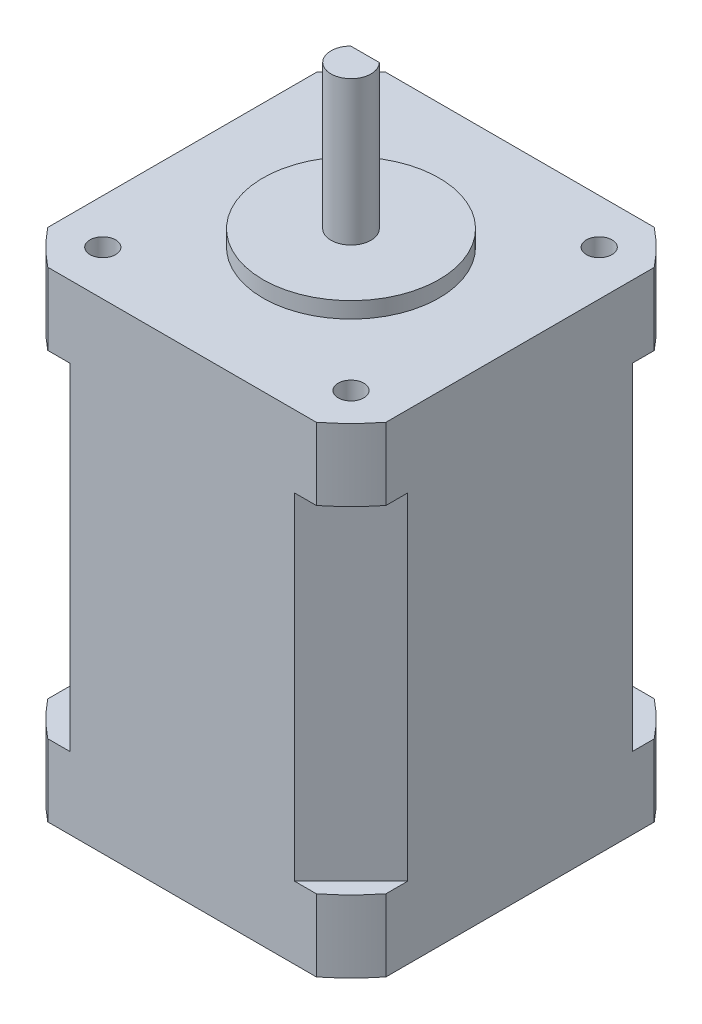
ISO-10303-21;
HEADER;
FILE_DESCRIPTION(('STEP AP214'),'2;1');
FILE_NAME('part.step','',(''),(''),'','','');
FILE_SCHEMA(('AUTOMOTIVE_DESIGN { 1 0 10303 214 1 1 1 1 }'));
ENDSEC;
DATA;
#1=APPLICATION_CONTEXT('core data for automotive mechanical design processes');
#2=APPLICATION_PROTOCOL_DEFINITION('international standard','automotive_design',2000,#1);
#3=PRODUCT_CONTEXT('',#1,'mechanical');
#4=PRODUCT('Part','Part','',(#3));
#5=PRODUCT_RELATED_PRODUCT_CATEGORY('part','',(#4));
#6=PRODUCT_DEFINITION_FORMATION('','',#4);
#7=PRODUCT_DEFINITION_CONTEXT('part definition',#1,'design');
#8=PRODUCT_DEFINITION('design','',#6,#7);
#9=PRODUCT_DEFINITION_SHAPE('','',#8);
#10=(LENGTH_UNIT() NAMED_UNIT(*) SI_UNIT(.MILLI.,.METRE.));
#11=(NAMED_UNIT(*) PLANE_ANGLE_UNIT() SI_UNIT($,.RADIAN.));
#12=(NAMED_UNIT(*) SI_UNIT($,.STERADIAN.) SOLID_ANGLE_UNIT());
#13=UNCERTAINTY_MEASURE_WITH_UNIT(LENGTH_MEASURE(1.E-05),#10,'distance_accuracy_value','');
#14=(GEOMETRIC_REPRESENTATION_CONTEXT(3) GLOBAL_UNCERTAINTY_ASSIGNED_CONTEXT((#13)) GLOBAL_UNIT_ASSIGNED_CONTEXT((#10,
#11,#12)) REPRESENTATION_CONTEXT('',''));
#15=CARTESIAN_POINT('',(0.,0.,0.));
#16=DIRECTION('',(0.,0.,1.));
#17=DIRECTION('',(1.,0.,0.));
#18=AXIS2_PLACEMENT_3D('',#15,#16,#17);
#19=CARTESIAN_POINT('',(-14.0127343282139,60.,-22.4477631707579));
#20=DIRECTION('',(0.707106781186551,0.,0.707106781186544));
#21=DIRECTION('',(0.707106781186544,0.,-0.707106781186551));
#22=AXIS2_PLACEMENT_3D('',#19,#20,#21);
#23=PLANE('',#22);
#24=DIRECTION('',(0.707106781186544,0.,-0.707106781186551));
#25=VECTOR('',#24,1.);
#26=CARTESIAN_POINT('',(-14.0127343282139,9.,-22.4477631707579));
#27=LINE('',#26,#25);
#28=CARTESIAN_POINT('',(-21.0838021400793,9.,-15.3766953588924));
#29=VERTEX_POINT('',#28);
#30=CARTESIAN_POINT('',(-14.0127343282139,9.,-22.4477631707579));
#31=VERTEX_POINT('',#30);
#32=EDGE_CURVE('E346',#29,#31,#27,.T.);
#33=ORIENTED_EDGE('',*,*,#32,.F.);
#34=DIRECTION('',(0.,-1.,0.));
#35=VECTOR('',#34,1.);
#36=CARTESIAN_POINT('',(-21.0838021400793,60.,-15.3766953588924));
#37=LINE('',#36,#35);
#38=CARTESIAN_POINT('',(-21.0838021400793,51.,-15.3766953588924));
#39=VERTEX_POINT('',#38);
#40=EDGE_CURVE('E485',#39,#29,#37,.T.);
#41=ORIENTED_EDGE('',*,*,#40,.F.);
#42=DIRECTION('',(-0.707106781186544,0.,0.707106781186551));
#43=VECTOR('',#42,1.);
#44=CARTESIAN_POINT('',(-14.0127343282139,51.,-22.4477631707579));
#45=LINE('',#44,#43);
#46=CARTESIAN_POINT('',(-14.0127343282139,51.,-22.4477631707579));
#47=VERTEX_POINT('',#46);
#48=EDGE_CURVE('E437',#47,#39,#45,.T.);
#49=ORIENTED_EDGE('',*,*,#48,.F.);
#50=DIRECTION('',(0.,-1.,0.));
#51=VECTOR('',#50,1.);
#52=CARTESIAN_POINT('',(-14.0127343282139,60.,-22.4477631707579));
#53=LINE('',#52,#51);
#54=EDGE_CURVE('E68',#47,#31,#53,.T.);
#55=ORIENTED_EDGE('',*,*,#54,.T.);
#56=EDGE_LOOP('',(#33,#41,#49,#55));
#57=FACE_BOUND('',#56,.T.);
#58=ADVANCED_FACE('F42',(#57),#23,.F.);
#59=CARTESIAN_POINT('',(-21.0838021400793,60.,12.6811690173767));
#60=DIRECTION('',(0.707106781186543,0.,-0.707106781186552));
#61=DIRECTION('',(-0.707106781186552,0.,-0.707106781186543));
#62=AXIS2_PLACEMENT_3D('',#59,#60,#61);
#63=PLANE('',#62);
#64=DIRECTION('',(-0.707106781186552,0.,-0.707106781186543));
#65=VECTOR('',#64,1.);
#66=CARTESIAN_POINT('',(-21.0838021400793,9.,12.6811690173767));
#67=LINE('',#66,#65);
#68=CARTESIAN_POINT('',(-14.0127343282138,9.,19.7522368292421));
#69=VERTEX_POINT('',#68);
#70=CARTESIAN_POINT('',(-21.0838021400793,9.,12.6811690173767));
#71=VERTEX_POINT('',#70);
#72=EDGE_CURVE('E342',#69,#71,#67,.T.);
#73=ORIENTED_EDGE('',*,*,#72,.F.);
#74=DIRECTION('',(0.,-1.,0.));
#75=VECTOR('',#74,1.);
#76=CARTESIAN_POINT('',(-14.0127343282138,60.,19.7522368292421));
#77=LINE('',#76,#75);
#78=CARTESIAN_POINT('',(-14.0127343282138,51.,19.7522368292421));
#79=VERTEX_POINT('',#78);
#80=EDGE_CURVE('E478',#79,#69,#77,.T.);
#81=ORIENTED_EDGE('',*,*,#80,.F.);
#82=DIRECTION('',(0.707106781186552,0.,0.707106781186543));
#83=VECTOR('',#82,1.);
#84=CARTESIAN_POINT('',(-21.0838021400793,51.,12.6811690173767));
#85=LINE('',#84,#83);
#86=CARTESIAN_POINT('',(-21.0838021400793,51.,12.6811690173767));
#87=VERTEX_POINT('',#86);
#88=EDGE_CURVE('E434',#87,#79,#85,.T.);
#89=ORIENTED_EDGE('',*,*,#88,.F.);
#90=DIRECTION('',(0.,-1.,0.));
#91=VECTOR('',#90,1.);
#92=CARTESIAN_POINT('',(-21.0838021400793,60.,12.6811690173767));
#93=LINE('',#92,#91);
#94=EDGE_CURVE('E482',#87,#71,#93,.T.);
#95=ORIENTED_EDGE('',*,*,#94,.T.);
#96=EDGE_LOOP('',(#73,#81,#89,#95));
#97=FACE_BOUND('',#96,.T.);
#98=ADVANCED_FACE('F586',(#97),#63,.F.);
#99=CARTESIAN_POINT('',(14.0451300480553,60.,19.7522368292421));
#100=DIRECTION('',(-0.707106781186551,0.,-0.707106781186544));
#101=DIRECTION('',(-0.707106781186544,0.,0.707106781186551));
#102=AXIS2_PLACEMENT_3D('',#99,#100,#101);
#103=PLANE('',#102);
#104=DIRECTION('',(-0.707106781186544,0.,0.707106781186551));
#105=VECTOR('',#104,1.);
#106=CARTESIAN_POINT('',(14.0451300480553,9.,19.7522368292421));
#107=LINE('',#106,#105);
#108=CARTESIAN_POINT('',(21.1161978599207,9.,12.6811690173766));
#109=VERTEX_POINT('',#108);
#110=CARTESIAN_POINT('',(14.0451300480553,9.,19.7522368292421));
#111=VERTEX_POINT('',#110);
#112=EDGE_CURVE('E338',#109,#111,#107,.T.);
#113=ORIENTED_EDGE('',*,*,#112,.F.);
#114=DIRECTION('',(0.,-1.,0.));
#115=VECTOR('',#114,1.);
#116=CARTESIAN_POINT('',(21.1161978599207,60.,12.6811690173766));
#117=LINE('',#116,#115);
#118=CARTESIAN_POINT('',(21.1161978599207,51.,12.6811690173766));
#119=VERTEX_POINT('',#118);
#120=EDGE_CURVE('E471',#119,#109,#117,.T.);
#121=ORIENTED_EDGE('',*,*,#120,.F.);
#122=DIRECTION('',(0.707106781186544,0.,-0.707106781186551));
#123=VECTOR('',#122,1.);
#124=CARTESIAN_POINT('',(14.0451300480553,51.,19.7522368292421));
#125=LINE('',#124,#123);
#126=CARTESIAN_POINT('',(14.0451300480553,51.,19.7522368292421));
#127=VERTEX_POINT('',#126);
#128=EDGE_CURVE('E431',#127,#119,#125,.T.);
#129=ORIENTED_EDGE('',*,*,#128,.F.);
#130=DIRECTION('',(0.,-1.,0.));
#131=VECTOR('',#130,1.);
#132=CARTESIAN_POINT('',(14.0451300480553,60.,19.7522368292421));
#133=LINE('',#132,#131);
#134=EDGE_CURVE('E475',#127,#111,#133,.T.);
#135=ORIENTED_EDGE('',*,*,#134,.T.);
#136=EDGE_LOOP('',(#113,#121,#129,#135));
#137=FACE_BOUND('',#136,.T.);
#138=ADVANCED_FACE('F608',(#137),#103,.F.);
#139=CARTESIAN_POINT('',(21.1161978599207,60.,-15.3766953588925));
#140=DIRECTION('',(-0.707106781186544,0.,0.707106781186551));
#141=DIRECTION('',(0.707106781186551,0.,0.707106781186544));
#142=AXIS2_PLACEMENT_3D('',#139,#140,#141);
#143=PLANE('',#142);
#144=DIRECTION('',(0.707106781186551,0.,0.707106781186544));
#145=VECTOR('',#144,1.);
#146=CARTESIAN_POINT('',(21.1161978599207,9.,-15.3766953588925));
#147=LINE('',#146,#145);
#148=CARTESIAN_POINT('',(14.0451300480552,9.,-22.4477631707579));
#149=VERTEX_POINT('',#148);
#150=CARTESIAN_POINT('',(21.1161978599207,9.,-15.3766953588925));
#151=VERTEX_POINT('',#150);
#152=EDGE_CURVE('E334',#149,#151,#147,.T.);
#153=ORIENTED_EDGE('',*,*,#152,.F.);
#154=DIRECTION('',(0.,-1.,0.));
#155=VECTOR('',#154,1.);
#156=CARTESIAN_POINT('',(14.0451300480552,60.,-22.4477631707579));
#157=LINE('',#156,#155);
#158=CARTESIAN_POINT('',(14.0451300480552,51.,-22.4477631707579));
#159=VERTEX_POINT('',#158);
#160=EDGE_CURVE('E454',#159,#149,#157,.T.);
#161=ORIENTED_EDGE('',*,*,#160,.F.);
#162=DIRECTION('',(-0.707106781186551,0.,-0.707106781186544));
#163=VECTOR('',#162,1.);
#164=CARTESIAN_POINT('',(21.1161978599207,51.,-15.3766953588925));
#165=LINE('',#164,#163);
#166=CARTESIAN_POINT('',(21.1161978599207,51.,-15.3766953588925));
#167=VERTEX_POINT('',#166);
#168=EDGE_CURVE('E46',#167,#159,#165,.T.);
#169=ORIENTED_EDGE('',*,*,#168,.F.);
#170=DIRECTION('',(0.,-1.,0.));
#171=VECTOR('',#170,1.);
#172=CARTESIAN_POINT('',(21.1161978599207,60.,-15.3766953588925));
#173=LINE('',#172,#171);
#174=EDGE_CURVE('E468',#167,#151,#173,.T.);
#175=ORIENTED_EDGE('',*,*,#174,.T.);
#176=EDGE_LOOP('',(#153,#161,#169,#175));
#177=FACE_BOUND('',#176,.T.);
#178=ADVANCED_FACE('F503',(#177),#143,.F.);
#179=CARTESIAN_POINT('',(-14.0127343282139,60.,-22.4477631707579));
#180=DIRECTION('',(0.,0.,1.));
#181=DIRECTION('',(1.,0.,0.));
#182=AXIS2_PLACEMENT_3D('',#179,#180,#181);
#183=PLANE('',#182);
#184=DIRECTION('',(-1.,0.,0.));
#185=VECTOR('',#184,1.);
#186=CARTESIAN_POINT('',(-14.0127343282139,0.,-22.4477631707579));
#187=LINE('',#186,#185);
#188=CARTESIAN_POINT('',(16.7762427840208,0.,-22.4477631707579));
#189=VERTEX_POINT('',#188);
#190=CARTESIAN_POINT('',(-16.7762427840208,0.,-22.4477631707579));
#191=VERTEX_POINT('',#190);
#192=EDGE_CURVE('E440',#189,#191,#187,.T.);
#193=ORIENTED_EDGE('',*,*,#192,.T.);
#194=DIRECTION('',(0.,-1.,0.));
#195=VECTOR('',#194,1.);
#196=CARTESIAN_POINT('',(-16.7762427840208,9.,-22.4477631707579));
#197=LINE('',#196,#195);
#198=CARTESIAN_POINT('',(-16.7762427840208,9.,-22.4477631707579));
#199=VERTEX_POINT('',#198);
#200=EDGE_CURVE('E322',#199,#191,#197,.T.);
#201=ORIENTED_EDGE('',*,*,#200,.F.);
#202=DIRECTION('',(1.,0.,0.));
#203=VECTOR('',#202,1.);
#204=CARTESIAN_POINT('',(-16.7762427840208,9.,-22.4477631707579));
#205=LINE('',#204,#203);
#206=EDGE_CURVE('E263',#199,#31,#205,.T.);
#207=ORIENTED_EDGE('',*,*,#206,.T.);
#208=ORIENTED_EDGE('',*,*,#54,.F.);
#209=DIRECTION('',(1.,0.,0.));
#210=VECTOR('',#209,1.);
#211=CARTESIAN_POINT('',(-16.7762427840208,51.,-22.4477631707579));
#212=LINE('',#211,#210);
#213=CARTESIAN_POINT('',(-16.7762427840208,51.,-22.4477631707579));
#214=VERTEX_POINT('',#213);
#215=EDGE_CURVE('E377',#214,#47,#212,.T.);
#216=ORIENTED_EDGE('',*,*,#215,.F.);
#217=DIRECTION('',(0.,1.,0.));
#218=VECTOR('',#217,1.);
#219=CARTESIAN_POINT('',(-16.7762427840208,51.,-22.4477631707579));
#220=LINE('',#219,#218);
#221=CARTESIAN_POINT('',(-16.7762427840208,60.,-22.4477631707579));
#222=VERTEX_POINT('',#221);
#223=EDGE_CURVE('E407',#214,#222,#220,.T.);
#224=ORIENTED_EDGE('',*,*,#223,.T.);
#225=DIRECTION('',(-1.,0.,0.));
#226=VECTOR('',#225,1.);
#227=CARTESIAN_POINT('',(-14.0127343282139,60.,-22.4477631707579));
#228=LINE('',#227,#226);
#229=CARTESIAN_POINT('',(16.7762427840208,60.,-22.4477631707579));
#230=VERTEX_POINT('',#229);
#231=EDGE_CURVE('E441',#230,#222,#228,.T.);
#232=ORIENTED_EDGE('',*,*,#231,.F.);
#233=DIRECTION('',(0.,1.,0.));
#234=VECTOR('',#233,1.);
#235=CARTESIAN_POINT('',(16.7762427840208,51.,-22.4477631707579));
#236=LINE('',#235,#234);
#237=CARTESIAN_POINT('',(16.7762427840208,51.,-22.4477631707579));
#238=VERTEX_POINT('',#237);
#239=EDGE_CURVE('E403',#238,#230,#236,.T.);
#240=ORIENTED_EDGE('',*,*,#239,.F.);
#241=EDGE_CURVE('E376',#159,#238,#212,.T.);
#242=ORIENTED_EDGE('',*,*,#241,.F.);
#243=ORIENTED_EDGE('',*,*,#160,.T.);
#244=CARTESIAN_POINT('',(16.7762427840208,9.,-22.4477631707579));
#245=VERTEX_POINT('',#244);
#246=EDGE_CURVE('E262',#149,#245,#205,.T.);
#247=ORIENTED_EDGE('',*,*,#246,.T.);
#248=DIRECTION('',(0.,-1.,0.));
#249=VECTOR('',#248,1.);
#250=CARTESIAN_POINT('',(16.7762427840208,9.,-22.4477631707579));
#251=LINE('',#250,#249);
#252=EDGE_CURVE('E326',#245,#189,#251,.T.);
#253=ORIENTED_EDGE('',*,*,#252,.T.);
#254=EDGE_LOOP('',(#193,#201,#207,#208,#216,#224,#232,#240,#242,#243,#247,#253));
#255=FACE_BOUND('',#254,.T.);
#256=ADVANCED_FACE('F44',(#255),#183,.F.);
#257=CARTESIAN_POINT('',(-21.0838021400793,60.,12.6811690173767));
#258=DIRECTION('',(1.,0.,0.));
#259=DIRECTION('',(0.,0.,-1.));
#260=AXIS2_PLACEMENT_3D('',#257,#258,#259);
#261=PLANE('',#260);
#262=DIRECTION('',(0.,0.,1.));
#263=VECTOR('',#262,1.);
#264=CARTESIAN_POINT('',(-21.0838021400793,0.,12.6811690173767));
#265=LINE('',#264,#263);
#266=CARTESIAN_POINT('',(-21.0838021400793,0.,-18.1443583396128));
#267=VERTEX_POINT('',#266);
#268=CARTESIAN_POINT('',(-21.0838021400793,0.,15.448831998097));
#269=VERTEX_POINT('',#268);
#270=EDGE_CURVE('E457',#267,#269,#265,.T.);
#271=ORIENTED_EDGE('',*,*,#270,.T.);
#272=DIRECTION('',(0.,-1.,0.));
#273=VECTOR('',#272,1.);
#274=CARTESIAN_POINT('',(-21.0838021400793,9.,15.448831998097));
#275=LINE('',#274,#273);
#276=CARTESIAN_POINT('',(-21.0838021400793,9.,15.448831998097));
#277=VERTEX_POINT('',#276);
#278=EDGE_CURVE('E314',#277,#269,#275,.T.);
#279=ORIENTED_EDGE('',*,*,#278,.F.);
#280=DIRECTION('',(0.,0.,1.));
#281=VECTOR('',#280,1.);
#282=CARTESIAN_POINT('',(-21.0838021400793,9.,-18.1443583396128));
#283=LINE('',#282,#281);
#284=EDGE_CURVE('E270',#71,#277,#283,.T.);
#285=ORIENTED_EDGE('',*,*,#284,.F.);
#286=ORIENTED_EDGE('',*,*,#94,.F.);
#287=DIRECTION('',(0.,0.,1.));
#288=VECTOR('',#287,1.);
#289=CARTESIAN_POINT('',(-21.0838021400793,51.,-18.1443583396128));
#290=LINE('',#289,#288);
#291=CARTESIAN_POINT('',(-21.0838021400793,51.,15.448831998097));
#292=VERTEX_POINT('',#291);
#293=EDGE_CURVE('E367',#87,#292,#290,.T.);
#294=ORIENTED_EDGE('',*,*,#293,.T.);
#295=DIRECTION('',(0.,1.,0.));
#296=VECTOR('',#295,1.);
#297=CARTESIAN_POINT('',(-21.0838021400793,51.,15.448831998097));
#298=LINE('',#297,#296);
#299=CARTESIAN_POINT('',(-21.0838021400793,60.,15.448831998097));
#300=VERTEX_POINT('',#299);
#301=EDGE_CURVE('E415',#292,#300,#298,.T.);
#302=ORIENTED_EDGE('',*,*,#301,.T.);
#303=DIRECTION('',(0.,0.,1.));
#304=VECTOR('',#303,1.);
#305=CARTESIAN_POINT('',(-21.0838021400793,60.,12.6811690173767));
#306=LINE('',#305,#304);
#307=CARTESIAN_POINT('',(-21.0838021400793,60.,-18.1443583396128));
#308=VERTEX_POINT('',#307);
#309=EDGE_CURVE('E444',#308,#300,#306,.T.);
#310=ORIENTED_EDGE('',*,*,#309,.F.);
#311=DIRECTION('',(0.,1.,0.));
#312=VECTOR('',#311,1.);
#313=CARTESIAN_POINT('',(-21.0838021400793,51.,-18.1443583396128));
#314=LINE('',#313,#312);
#315=CARTESIAN_POINT('',(-21.0838021400793,51.,-18.1443583396128));
#316=VERTEX_POINT('',#315);
#317=EDGE_CURVE('E411',#316,#308,#314,.T.);
#318=ORIENTED_EDGE('',*,*,#317,.F.);
#319=EDGE_CURVE('E368',#316,#39,#290,.T.);
#320=ORIENTED_EDGE('',*,*,#319,.T.);
#321=ORIENTED_EDGE('',*,*,#40,.T.);
#322=CARTESIAN_POINT('',(-21.0838021400793,9.,-18.1443583396128));
#323=VERTEX_POINT('',#322);
#324=EDGE_CURVE('E271',#323,#29,#283,.T.);
#325=ORIENTED_EDGE('',*,*,#324,.F.);
#326=DIRECTION('',(0.,-1.,0.));
#327=VECTOR('',#326,1.);
#328=CARTESIAN_POINT('',(-21.0838021400793,9.,-18.1443583396128));
#329=LINE('',#328,#327);
#330=EDGE_CURVE('E318',#323,#267,#329,.T.);
#331=ORIENTED_EDGE('',*,*,#330,.T.);
#332=EDGE_LOOP('',(#271,#279,#285,#286,#294,#302,#310,#318,#320,#321,#325,#331));
#333=FACE_BOUND('',#332,.T.);
#334=ADVANCED_FACE('F538',(#333),#261,.F.);
#335=CARTESIAN_POINT('',(-14.0127343282138,60.,19.7522368292421));
#336=DIRECTION('',(0.,0.,-1.));
#337=DIRECTION('',(-1.,0.,0.));
#338=AXIS2_PLACEMENT_3D('',#335,#336,#337);
#339=PLANE('',#338);
#340=DIRECTION('',(1.,0.,0.));
#341=VECTOR('',#340,1.);
#342=CARTESIAN_POINT('',(-14.0127343282138,0.,19.7522368292421));
#343=LINE('',#342,#341);
#344=CARTESIAN_POINT('',(-16.7762427840208,0.,19.7522368292421));
#345=VERTEX_POINT('',#344);
#346=CARTESIAN_POINT('',(16.7762427840208,0.,19.7522368292421));
#347=VERTEX_POINT('',#346);
#348=EDGE_CURVE('E460',#345,#347,#343,.T.);
#349=ORIENTED_EDGE('',*,*,#348,.T.);
#350=DIRECTION('',(0.,-1.,0.));
#351=VECTOR('',#350,1.);
#352=CARTESIAN_POINT('',(16.7762427840208,9.,19.7522368292421));
#353=LINE('',#352,#351);
#354=CARTESIAN_POINT('',(16.7762427840208,9.,19.7522368292421));
#355=VERTEX_POINT('',#354);
#356=EDGE_CURVE('E306',#355,#347,#353,.T.);
#357=ORIENTED_EDGE('',*,*,#356,.F.);
#358=DIRECTION('',(1.,0.,0.));
#359=VECTOR('',#358,1.);
#360=CARTESIAN_POINT('',(-16.7762427840208,9.,19.7522368292421));
#361=LINE('',#360,#359);
#362=EDGE_CURVE('E278',#111,#355,#361,.T.);
#363=ORIENTED_EDGE('',*,*,#362,.F.);
#364=ORIENTED_EDGE('',*,*,#134,.F.);
#365=DIRECTION('',(1.,0.,0.));
#366=VECTOR('',#365,1.);
#367=CARTESIAN_POINT('',(-16.7762427840208,51.,19.7522368292421));
#368=LINE('',#367,#366);
#369=CARTESIAN_POINT('',(16.7762427840208,51.,19.7522368292421));
#370=VERTEX_POINT('',#369);
#371=EDGE_CURVE('E358',#127,#370,#368,.T.);
#372=ORIENTED_EDGE('',*,*,#371,.T.);
#373=DIRECTION('',(0.,1.,0.));
#374=VECTOR('',#373,1.);
#375=CARTESIAN_POINT('',(16.7762427840208,51.,19.7522368292421));
#376=LINE('',#375,#374);
#377=CARTESIAN_POINT('',(16.7762427840208,60.,19.7522368292421));
#378=VERTEX_POINT('',#377);
#379=EDGE_CURVE('E423',#370,#378,#376,.T.);
#380=ORIENTED_EDGE('',*,*,#379,.T.);
#381=DIRECTION('',(1.,0.,0.));
#382=VECTOR('',#381,1.);
#383=CARTESIAN_POINT('',(-14.0127343282138,60.,19.7522368292421));
#384=LINE('',#383,#382);
#385=CARTESIAN_POINT('',(-16.7762427840208,60.,19.7522368292421));
#386=VERTEX_POINT('',#385);
#387=EDGE_CURVE('E448',#386,#378,#384,.T.);
#388=ORIENTED_EDGE('',*,*,#387,.F.);
#389=DIRECTION('',(0.,1.,0.));
#390=VECTOR('',#389,1.);
#391=CARTESIAN_POINT('',(-16.7762427840208,51.,19.7522368292421));
#392=LINE('',#391,#390);
#393=CARTESIAN_POINT('',(-16.7762427840208,51.,19.7522368292421));
#394=VERTEX_POINT('',#393);
#395=EDGE_CURVE('E419',#394,#386,#392,.T.);
#396=ORIENTED_EDGE('',*,*,#395,.F.);
#397=EDGE_CURVE('E359',#394,#79,#368,.T.);
#398=ORIENTED_EDGE('',*,*,#397,.T.);
#399=ORIENTED_EDGE('',*,*,#80,.T.);
#400=CARTESIAN_POINT('',(-16.7762427840208,9.,19.7522368292421));
#401=VERTEX_POINT('',#400);
#402=EDGE_CURVE('E279',#401,#69,#361,.T.);
#403=ORIENTED_EDGE('',*,*,#402,.F.);
#404=DIRECTION('',(0.,-1.,0.));
#405=VECTOR('',#404,1.);
#406=CARTESIAN_POINT('',(-16.7762427840208,9.,19.7522368292421));
#407=LINE('',#406,#405);
#408=EDGE_CURVE('E310',#401,#345,#407,.T.);
#409=ORIENTED_EDGE('',*,*,#408,.T.);
#410=EDGE_LOOP('',(#349,#357,#363,#364,#372,#380,#388,#396,#398,#399,#403,#409));
#411=FACE_BOUND('',#410,.T.);
#412=ADVANCED_FACE('F565',(#411),#339,.F.);
#413=CARTESIAN_POINT('',(21.1161978599207,60.,12.6811690173766));
#414=DIRECTION('',(-1.,0.,0.));
#415=DIRECTION('',(0.,0.,1.));
#416=AXIS2_PLACEMENT_3D('',#413,#414,#415);
#417=PLANE('',#416);
#418=DIRECTION('',(0.,0.,-1.));
#419=VECTOR('',#418,1.);
#420=CARTESIAN_POINT('',(21.1161978599207,0.,12.6811690173766));
#421=LINE('',#420,#419);
#422=CARTESIAN_POINT('',(21.1161978599207,0.,15.4080868491334));
#423=VERTEX_POINT('',#422);
#424=CARTESIAN_POINT('',(21.1161978599207,0.,-18.1036131906492));
#425=VERTEX_POINT('',#424);
#426=EDGE_CURVE('E445',#423,#425,#421,.T.);
#427=ORIENTED_EDGE('',*,*,#426,.T.);
#428=DIRECTION('',(0.,-1.,0.));
#429=VECTOR('',#428,1.);
#430=CARTESIAN_POINT('',(21.1161978599207,9.,-18.1036131906492));
#431=LINE('',#430,#429);
#432=CARTESIAN_POINT('',(21.1161978599207,9.,-18.1036131906492));
#433=VERTEX_POINT('',#432);
#434=EDGE_CURVE('E330',#433,#425,#431,.T.);
#435=ORIENTED_EDGE('',*,*,#434,.F.);
#436=DIRECTION('',(0.,0.,1.));
#437=VECTOR('',#436,1.);
#438=CARTESIAN_POINT('',(21.1161978599207,9.,-18.1036131906492));
#439=LINE('',#438,#437);
#440=EDGE_CURVE('E253',#433,#151,#439,.T.);
#441=ORIENTED_EDGE('',*,*,#440,.T.);
#442=ORIENTED_EDGE('',*,*,#174,.F.);
#443=DIRECTION('',(0.,0.,1.));
#444=VECTOR('',#443,1.);
#445=CARTESIAN_POINT('',(21.1161978599207,51.,-18.1036131906492));
#446=LINE('',#445,#444);
#447=CARTESIAN_POINT('',(21.1161978599207,51.,-18.1036131906492));
#448=VERTEX_POINT('',#447);
#449=EDGE_CURVE('E350',#448,#167,#446,.T.);
#450=ORIENTED_EDGE('',*,*,#449,.F.);
#451=DIRECTION('',(0.,1.,0.));
#452=VECTOR('',#451,1.);
#453=CARTESIAN_POINT('',(21.1161978599207,51.,-18.1036131906492));
#454=LINE('',#453,#452);
#455=CARTESIAN_POINT('',(21.1161978599207,60.,-18.1036131906492));
#456=VERTEX_POINT('',#455);
#457=EDGE_CURVE('E384',#448,#456,#454,.T.);
#458=ORIENTED_EDGE('',*,*,#457,.T.);
#459=DIRECTION('',(0.,0.,-1.));
#460=VECTOR('',#459,1.);
#461=CARTESIAN_POINT('',(21.1161978599207,60.,12.6811690173766));
#462=LINE('',#461,#460);
#463=CARTESIAN_POINT('',(21.1161978599207,60.,15.4080868491334));
#464=VERTEX_POINT('',#463);
#465=EDGE_CURVE('E451',#464,#456,#462,.T.);
#466=ORIENTED_EDGE('',*,*,#465,.F.);
#467=DIRECTION('',(0.,1.,0.));
#468=VECTOR('',#467,1.);
#469=CARTESIAN_POINT('',(21.1161978599207,51.,15.4080868491334));
#470=LINE('',#469,#468);
#471=CARTESIAN_POINT('',(21.1161978599207,51.,15.4080868491334));
#472=VERTEX_POINT('',#471);
#473=EDGE_CURVE('E427',#472,#464,#470,.T.);
#474=ORIENTED_EDGE('',*,*,#473,.F.);
#475=EDGE_CURVE('E354',#119,#472,#446,.T.);
#476=ORIENTED_EDGE('',*,*,#475,.F.);
#477=ORIENTED_EDGE('',*,*,#120,.T.);
#478=CARTESIAN_POINT('',(21.1161978599207,9.,15.4080868491334));
#479=VERTEX_POINT('',#478);
#480=EDGE_CURVE('E258',#109,#479,#439,.T.);
#481=ORIENTED_EDGE('',*,*,#480,.T.);
#482=DIRECTION('',(0.,-1.,0.));
#483=VECTOR('',#482,1.);
#484=CARTESIAN_POINT('',(21.1161978599207,9.,15.4080868491334));
#485=LINE('',#484,#483);
#486=EDGE_CURVE('E287',#479,#423,#485,.T.);
#487=ORIENTED_EDGE('',*,*,#486,.T.);
#488=EDGE_LOOP('',(#427,#435,#441,#442,#450,#458,#466,#474,#476,#477,#481,#487));
#489=FACE_BOUND('',#488,.T.);
#490=ADVANCED_FACE('F508',(#489),#417,.F.);
#491=CARTESIAN_POINT('',(0.,60.,0.));
#492=DIRECTION('',(0.,1.,0.));
#493=DIRECTION('',(0.,0.,1.));
#494=AXIS2_PLACEMENT_3D('',#491,#492,#493);
#495=PLANE('',#494);
#496=CARTESIAN_POINT('',(-15.4999999999997,60.,14.1522368292419));
#497=DIRECTION('',(0.,1.,0.));
#498=DIRECTION('',(0.,0.,1.));
#499=AXIS2_PLACEMENT_3D('',#496,#497,#498);
#500=CIRCLE('',#499,1.6);
#501=CARTESIAN_POINT('',(-15.4999999999997,60.,15.7522368292419));
#502=VERTEX_POINT('',#501);
#503=EDGE_CURVE('E1045',#502,#502,#500,.T.);
#504=ORIENTED_EDGE('',*,*,#503,.F.);
#505=EDGE_LOOP('',(#504));
#506=FACE_BOUND('',#505,.T.);
#507=CARTESIAN_POINT('',(15.5000000000003,60.,14.1522368292418));
#508=DIRECTION('',(0.,1.,0.));
#509=DIRECTION('',(0.,0.,1.));
#510=AXIS2_PLACEMENT_3D('',#507,#508,#509);
#511=CIRCLE('',#510,1.6);
#512=CARTESIAN_POINT('',(15.5000000000003,60.,15.7522368292418));
#513=VERTEX_POINT('',#512);
#514=EDGE_CURVE('E1069',#513,#513,#511,.T.);
#515=ORIENTED_EDGE('',*,*,#514,.F.);
#516=EDGE_LOOP('',(#515));
#517=FACE_BOUND('',#516,.T.);
#518=CARTESIAN_POINT('',(15.5000000000001,60.,-16.8477631707583));
#519=DIRECTION('',(0.,1.,0.));
#520=DIRECTION('',(0.,0.,1.));
#521=AXIS2_PLACEMENT_3D('',#518,#519,#520);
#522=CIRCLE('',#521,1.6);
#523=CARTESIAN_POINT('',(15.5000000000001,60.,-15.2477631707583));
#524=VERTEX_POINT('',#523);
#525=EDGE_CURVE('E1060',#524,#524,#522,.T.);
#526=ORIENTED_EDGE('',*,*,#525,.F.);
#527=EDGE_LOOP('',(#526));
#528=FACE_BOUND('',#527,.T.);
#529=CARTESIAN_POINT('',(-15.5,60.,-16.8477631707579));
#530=DIRECTION('',(0.,1.,0.));
#531=DIRECTION('',(0.,0.,1.));
#532=AXIS2_PLACEMENT_3D('',#529,#530,#531);
#533=CIRCLE('',#532,1.6);
#534=CARTESIAN_POINT('',(-15.5,60.,-15.2477631707579));
#535=VERTEX_POINT('',#534);
#536=EDGE_CURVE('E1057',#535,#535,#533,.T.);
#537=ORIENTED_EDGE('',*,*,#536,.F.);
#538=EDGE_LOOP('',(#537));
#539=FACE_BOUND('',#538,.T.);
#540=CARTESIAN_POINT('',(0.,60.,-1.34776317075791));
#541=DIRECTION('',(0.,1.,0.));
#542=DIRECTION('',(0.,0.,1.));
#543=AXIS2_PLACEMENT_3D('',#540,#541,#542);
#544=CIRCLE('',#543,11.);
#545=CARTESIAN_POINT('',(0.,60.,9.65223682924209));
#546=VERTEX_POINT('',#545);
#547=EDGE_CURVE('E52',#546,#546,#544,.T.);
#548=ORIENTED_EDGE('',*,*,#547,.F.);
#549=EDGE_LOOP('',(#548));
#550=FACE_BOUND('',#549,.T.);
#551=ORIENTED_EDGE('',*,*,#231,.T.);
#552=CARTESIAN_POINT('',(0.,60.,-1.3477631707579));
#553=DIRECTION('',(0.,1.,0.));
#554=DIRECTION('',(0.,0.,1.));
#555=AXIS2_PLACEMENT_3D('',#552,#553,#554);
#556=CIRCLE('',#555,26.9564894218148);
#557=EDGE_CURVE('E392',#222,#308,#556,.T.);
#558=ORIENTED_EDGE('',*,*,#557,.T.);
#559=ORIENTED_EDGE('',*,*,#309,.T.);
#560=CARTESIAN_POINT('',(0.,60.,-1.3477631707579));
#561=DIRECTION('',(0.,1.,0.));
#562=DIRECTION('',(0.,0.,1.));
#563=AXIS2_PLACEMENT_3D('',#560,#561,#562);
#564=CIRCLE('',#563,26.9564894218148);
#565=EDGE_CURVE('E388',#300,#386,#564,.T.);
#566=ORIENTED_EDGE('',*,*,#565,.T.);
#567=ORIENTED_EDGE('',*,*,#387,.T.);
#568=CARTESIAN_POINT('',(0.,60.,-1.3477631707579));
#569=DIRECTION('',(0.,1.,0.));
#570=DIRECTION('',(0.,0.,1.));
#571=AXIS2_PLACEMENT_3D('',#568,#569,#570);
#572=CIRCLE('',#571,26.9564894218148);
#573=EDGE_CURVE('E349',#378,#464,#572,.T.);
#574=ORIENTED_EDGE('',*,*,#573,.T.);
#575=ORIENTED_EDGE('',*,*,#465,.T.);
#576=CARTESIAN_POINT('',(0.,60.,-1.3477631707579));
#577=DIRECTION('',(0.,1.,0.));
#578=DIRECTION('',(0.,0.,1.));
#579=AXIS2_PLACEMENT_3D('',#576,#577,#578);
#580=CIRCLE('',#579,26.9564894218148);
#581=EDGE_CURVE('E396',#456,#230,#580,.T.);
#582=ORIENTED_EDGE('',*,*,#581,.T.);
#583=EDGE_LOOP('',(#551,#558,#559,#566,#567,#574,#575,#582));
#584=FACE_BOUND('',#583,.T.);
#585=ADVANCED_FACE('F553',(#506,#517,#528,#539,#550,#584),#495,.T.);
#586=CARTESIAN_POINT('',(0.,0.,0.));
#587=DIRECTION('',(0.,1.,0.));
#588=DIRECTION('',(0.,0.,1.));
#589=AXIS2_PLACEMENT_3D('',#586,#587,#588);
#590=PLANE('',#589);
#591=ORIENTED_EDGE('',*,*,#192,.F.);
#592=CARTESIAN_POINT('',(0.,0.,-1.3477631707579));
#593=DIRECTION('',(0.,1.,0.));
#594=DIRECTION('',(0.,0.,1.));
#595=AXIS2_PLACEMENT_3D('',#592,#593,#594);
#596=CIRCLE('',#595,26.9564894218148);
#597=EDGE_CURVE('E249',#425,#189,#596,.T.);
#598=ORIENTED_EDGE('',*,*,#597,.F.);
#599=ORIENTED_EDGE('',*,*,#426,.F.);
#600=CARTESIAN_POINT('',(0.,0.,-1.3477631707579));
#601=DIRECTION('',(0.,1.,0.));
#602=DIRECTION('',(0.,0.,1.));
#603=AXIS2_PLACEMENT_3D('',#600,#601,#602);
#604=CIRCLE('',#603,26.9564894218148);
#605=EDGE_CURVE('E299',#347,#423,#604,.T.);
#606=ORIENTED_EDGE('',*,*,#605,.F.);
#607=ORIENTED_EDGE('',*,*,#348,.F.);
#608=CARTESIAN_POINT('',(0.,0.,-1.3477631707579));
#609=DIRECTION('',(0.,1.,0.));
#610=DIRECTION('',(0.,0.,1.));
#611=AXIS2_PLACEMENT_3D('',#608,#609,#610);
#612=CIRCLE('',#611,26.9564894218148);
#613=EDGE_CURVE('E295',#269,#345,#612,.T.);
#614=ORIENTED_EDGE('',*,*,#613,.F.);
#615=ORIENTED_EDGE('',*,*,#270,.F.);
#616=CARTESIAN_POINT('',(0.,0.,-1.3477631707579));
#617=DIRECTION('',(0.,1.,0.));
#618=DIRECTION('',(0.,0.,1.));
#619=AXIS2_PLACEMENT_3D('',#616,#617,#618);
#620=CIRCLE('',#619,26.9564894218148);
#621=EDGE_CURVE('E291',#191,#267,#620,.T.);
#622=ORIENTED_EDGE('',*,*,#621,.F.);
#623=EDGE_LOOP('',(#591,#598,#599,#606,#607,#614,#615,#622));
#624=FACE_BOUND('',#623,.T.);
#625=ADVANCED_FACE('F529',(#624),#590,.F.);
#626=CARTESIAN_POINT('',(0.,51.,-1.3477631707579));
#627=DIRECTION('',(0.,1.,0.));
#628=DIRECTION('',(0.,0.,1.));
#629=AXIS2_PLACEMENT_3D('',#626,#627,#628);
#630=CYLINDRICAL_SURFACE('',#629,26.9564894218148);
#631=ORIENTED_EDGE('',*,*,#581,.F.);
#632=ORIENTED_EDGE('',*,*,#457,.F.);
#633=CARTESIAN_POINT('',(0.,51.,-1.3477631707579));
#634=DIRECTION('',(0.,1.,0.));
#635=DIRECTION('',(0.,0.,1.));
#636=AXIS2_PLACEMENT_3D('',#633,#634,#635);
#637=CIRCLE('',#636,26.9564894218148);
#638=EDGE_CURVE('E380',#448,#238,#637,.T.);
#639=ORIENTED_EDGE('',*,*,#638,.T.);
#640=ORIENTED_EDGE('',*,*,#239,.T.);
#641=EDGE_LOOP('',(#631,#632,#639,#640));
#642=FACE_BOUND('',#641,.T.);
#643=ADVANCED_FACE('F556',(#642),#630,.T.);
#644=CARTESIAN_POINT('',(0.,51.,-1.3477631707579));
#645=DIRECTION('',(0.,1.,0.));
#646=DIRECTION('',(0.,0.,1.));
#647=AXIS2_PLACEMENT_3D('',#644,#645,#646);
#648=PLANE('',#647);
#649=ORIENTED_EDGE('',*,*,#449,.T.);
#650=ORIENTED_EDGE('',*,*,#168,.T.);
#651=ORIENTED_EDGE('',*,*,#241,.T.);
#652=ORIENTED_EDGE('',*,*,#638,.F.);
#653=EDGE_LOOP('',(#649,#650,#651,#652));
#654=FACE_BOUND('',#653,.T.);
#655=ADVANCED_FACE('F493',(#654),#648,.F.);
#656=CARTESIAN_POINT('',(0.,51.,-1.3477631707579));
#657=DIRECTION('',(0.,1.,0.));
#658=DIRECTION('',(0.,0.,1.));
#659=AXIS2_PLACEMENT_3D('',#656,#657,#658);
#660=CYLINDRICAL_SURFACE('',#659,26.9564894218148);
#661=ORIENTED_EDGE('',*,*,#573,.F.);
#662=ORIENTED_EDGE('',*,*,#379,.F.);
#663=CARTESIAN_POINT('',(0.,51.,-1.3477631707579));
#664=DIRECTION('',(0.,1.,0.));
#665=DIRECTION('',(0.,0.,1.));
#666=AXIS2_PLACEMENT_3D('',#663,#664,#665);
#667=CIRCLE('',#666,26.9564894218148);
#668=EDGE_CURVE('E353',#370,#472,#667,.T.);
#669=ORIENTED_EDGE('',*,*,#668,.T.);
#670=ORIENTED_EDGE('',*,*,#473,.T.);
#671=EDGE_LOOP('',(#661,#662,#669,#670));
#672=FACE_BOUND('',#671,.T.);
#673=ADVANCED_FACE('F560',(#672),#660,.T.);
#674=ORIENTED_EDGE('',*,*,#371,.F.);
#675=ORIENTED_EDGE('',*,*,#128,.T.);
#676=ORIENTED_EDGE('',*,*,#475,.T.);
#677=ORIENTED_EDGE('',*,*,#668,.F.);
#678=EDGE_LOOP('',(#674,#675,#676,#677));
#679=FACE_BOUND('',#678,.T.);
#680=ADVANCED_FACE('F568',(#679),#648,.F.);
#681=CARTESIAN_POINT('',(0.,51.,-1.3477631707579));
#682=DIRECTION('',(0.,1.,0.));
#683=DIRECTION('',(0.,0.,1.));
#684=AXIS2_PLACEMENT_3D('',#681,#682,#683);
#685=CYLINDRICAL_SURFACE('',#684,26.9564894218148);
#686=ORIENTED_EDGE('',*,*,#565,.F.);
#687=ORIENTED_EDGE('',*,*,#301,.F.);
#688=CARTESIAN_POINT('',(0.,51.,-1.3477631707579));
#689=DIRECTION('',(0.,1.,0.));
#690=DIRECTION('',(0.,0.,1.));
#691=AXIS2_PLACEMENT_3D('',#688,#689,#690);
#692=CIRCLE('',#691,26.9564894218148);
#693=EDGE_CURVE('E363',#292,#394,#692,.T.);
#694=ORIENTED_EDGE('',*,*,#693,.T.);
#695=ORIENTED_EDGE('',*,*,#395,.T.);
#696=EDGE_LOOP('',(#686,#687,#694,#695));
#697=FACE_BOUND('',#696,.T.);
#698=ADVANCED_FACE('F592',(#697),#685,.T.);
#699=ORIENTED_EDGE('',*,*,#293,.F.);
#700=ORIENTED_EDGE('',*,*,#88,.T.);
#701=ORIENTED_EDGE('',*,*,#397,.F.);
#702=ORIENTED_EDGE('',*,*,#693,.F.);
#703=EDGE_LOOP('',(#699,#700,#701,#702));
#704=FACE_BOUND('',#703,.T.);
#705=ADVANCED_FACE('F593',(#704),#648,.F.);
#706=ORIENTED_EDGE('',*,*,#215,.T.);
#707=ORIENTED_EDGE('',*,*,#48,.T.);
#708=ORIENTED_EDGE('',*,*,#319,.F.);
#709=CARTESIAN_POINT('',(0.,51.,-1.3477631707579));
#710=DIRECTION('',(0.,1.,0.));
#711=DIRECTION('',(0.,0.,1.));
#712=AXIS2_PLACEMENT_3D('',#709,#710,#711);
#713=CIRCLE('',#712,26.9564894218148);
#714=EDGE_CURVE('E372',#214,#316,#713,.T.);
#715=ORIENTED_EDGE('',*,*,#714,.F.);
#716=EDGE_LOOP('',(#706,#707,#708,#715));
#717=FACE_BOUND('',#716,.T.);
#718=ADVANCED_FACE('F549',(#717),#648,.F.);
#719=CARTESIAN_POINT('',(0.,51.,-1.3477631707579));
#720=DIRECTION('',(0.,1.,0.));
#721=DIRECTION('',(0.,0.,1.));
#722=AXIS2_PLACEMENT_3D('',#719,#720,#721);
#723=CYLINDRICAL_SURFACE('',#722,26.9564894218148);
#724=ORIENTED_EDGE('',*,*,#557,.F.);
#725=ORIENTED_EDGE('',*,*,#223,.F.);
#726=ORIENTED_EDGE('',*,*,#714,.T.);
#727=ORIENTED_EDGE('',*,*,#317,.T.);
#728=EDGE_LOOP('',(#724,#725,#726,#727));
#729=FACE_BOUND('',#728,.T.);
#730=ADVANCED_FACE('F551',(#729),#723,.T.);
#731=CARTESIAN_POINT('',(0.,9.,-1.3477631707579));
#732=DIRECTION('',(0.,-1.,0.));
#733=DIRECTION('',(0.,0.,-1.));
#734=AXIS2_PLACEMENT_3D('',#731,#732,#733);
#735=CYLINDRICAL_SURFACE('',#734,26.9564894218148);
#736=ORIENTED_EDGE('',*,*,#597,.T.);
#737=ORIENTED_EDGE('',*,*,#252,.F.);
#738=CARTESIAN_POINT('',(0.,9.,-1.3477631707579));
#739=DIRECTION('',(0.,1.,0.));
#740=DIRECTION('',(0.,0.,1.));
#741=AXIS2_PLACEMENT_3D('',#738,#739,#740);
#742=CIRCLE('',#741,26.9564894218148);
#743=EDGE_CURVE('E257',#433,#245,#742,.T.);
#744=ORIENTED_EDGE('',*,*,#743,.F.);
#745=ORIENTED_EDGE('',*,*,#434,.T.);
#746=EDGE_LOOP('',(#736,#737,#744,#745));
#747=FACE_BOUND('',#746,.T.);
#748=ADVANCED_FACE('F513',(#747),#735,.T.);
#749=CARTESIAN_POINT('',(0.,9.,-1.3477631707579));
#750=DIRECTION('',(0.,-1.,0.));
#751=DIRECTION('',(0.,0.,1.));
#752=AXIS2_PLACEMENT_3D('',#749,#750,#751);
#753=PLANE('',#752);
#754=ORIENTED_EDGE('',*,*,#246,.F.);
#755=ORIENTED_EDGE('',*,*,#152,.T.);
#756=ORIENTED_EDGE('',*,*,#440,.F.);
#757=ORIENTED_EDGE('',*,*,#743,.T.);
#758=EDGE_LOOP('',(#754,#755,#756,#757));
#759=FACE_BOUND('',#758,.T.);
#760=ADVANCED_FACE('F506',(#759),#753,.F.);
#761=CARTESIAN_POINT('',(0.,9.,-1.3477631707579));
#762=DIRECTION('',(0.,-1.,0.));
#763=DIRECTION('',(0.,0.,-1.));
#764=AXIS2_PLACEMENT_3D('',#761,#762,#763);
#765=CYLINDRICAL_SURFACE('',#764,26.9564894218148);
#766=ORIENTED_EDGE('',*,*,#605,.T.);
#767=ORIENTED_EDGE('',*,*,#486,.F.);
#768=CARTESIAN_POINT('',(0.,9.,-1.3477631707579));
#769=DIRECTION('',(0.,1.,0.));
#770=DIRECTION('',(0.,0.,1.));
#771=AXIS2_PLACEMENT_3D('',#768,#769,#770);
#772=CIRCLE('',#771,26.9564894218148);
#773=EDGE_CURVE('E283',#355,#479,#772,.T.);
#774=ORIENTED_EDGE('',*,*,#773,.F.);
#775=ORIENTED_EDGE('',*,*,#356,.T.);
#776=EDGE_LOOP('',(#766,#767,#774,#775));
#777=FACE_BOUND('',#776,.T.);
#778=ADVANCED_FACE('F526',(#777),#765,.T.);
#779=ORIENTED_EDGE('',*,*,#480,.F.);
#780=ORIENTED_EDGE('',*,*,#112,.T.);
#781=ORIENTED_EDGE('',*,*,#362,.T.);
#782=ORIENTED_EDGE('',*,*,#773,.T.);
#783=EDGE_LOOP('',(#779,#780,#781,#782));
#784=FACE_BOUND('',#783,.T.);
#785=ADVANCED_FACE('F522',(#784),#753,.F.);
#786=CARTESIAN_POINT('',(0.,9.,-1.3477631707579));
#787=DIRECTION('',(0.,-1.,0.));
#788=DIRECTION('',(0.,0.,-1.));
#789=AXIS2_PLACEMENT_3D('',#786,#787,#788);
#790=CYLINDRICAL_SURFACE('',#789,26.9564894218148);
#791=ORIENTED_EDGE('',*,*,#613,.T.);
#792=ORIENTED_EDGE('',*,*,#408,.F.);
#793=CARTESIAN_POINT('',(0.,9.,-1.3477631707579));
#794=DIRECTION('',(0.,1.,0.));
#795=DIRECTION('',(0.,0.,1.));
#796=AXIS2_PLACEMENT_3D('',#793,#794,#795);
#797=CIRCLE('',#796,26.9564894218148);
#798=EDGE_CURVE('E275',#277,#401,#797,.T.);
#799=ORIENTED_EDGE('',*,*,#798,.F.);
#800=ORIENTED_EDGE('',*,*,#278,.T.);
#801=EDGE_LOOP('',(#791,#792,#799,#800));
#802=FACE_BOUND('',#801,.T.);
#803=ADVANCED_FACE('F580',(#802),#790,.T.);
#804=ORIENTED_EDGE('',*,*,#402,.T.);
#805=ORIENTED_EDGE('',*,*,#72,.T.);
#806=ORIENTED_EDGE('',*,*,#284,.T.);
#807=ORIENTED_EDGE('',*,*,#798,.T.);
#808=EDGE_LOOP('',(#804,#805,#806,#807));
#809=FACE_BOUND('',#808,.T.);
#810=ADVANCED_FACE('F575',(#809),#753,.F.);
#811=ORIENTED_EDGE('',*,*,#324,.T.);
#812=ORIENTED_EDGE('',*,*,#32,.T.);
#813=ORIENTED_EDGE('',*,*,#206,.F.);
#814=CARTESIAN_POINT('',(0.,9.,-1.3477631707579));
#815=DIRECTION('',(0.,1.,0.));
#816=DIRECTION('',(0.,0.,1.));
#817=AXIS2_PLACEMENT_3D('',#814,#815,#816);
#818=CIRCLE('',#817,26.9564894218148);
#819=EDGE_CURVE('E267',#199,#323,#818,.T.);
#820=ORIENTED_EDGE('',*,*,#819,.T.);
#821=EDGE_LOOP('',(#811,#812,#813,#820));
#822=FACE_BOUND('',#821,.T.);
#823=ADVANCED_FACE('F542',(#822),#753,.F.);
#824=CARTESIAN_POINT('',(0.,9.,-1.3477631707579));
#825=DIRECTION('',(0.,-1.,0.));
#826=DIRECTION('',(0.,0.,-1.));
#827=AXIS2_PLACEMENT_3D('',#824,#825,#826);
#828=CYLINDRICAL_SURFACE('',#827,26.9564894218148);
#829=ORIENTED_EDGE('',*,*,#621,.T.);
#830=ORIENTED_EDGE('',*,*,#330,.F.);
#831=ORIENTED_EDGE('',*,*,#819,.F.);
#832=ORIENTED_EDGE('',*,*,#200,.T.);
#833=EDGE_LOOP('',(#829,#830,#831,#832));
#834=FACE_BOUND('',#833,.T.);
#835=ADVANCED_FACE('F534',(#834),#828,.T.);
#836=CARTESIAN_POINT('',(0.,62.,-1.34776317075791));
#837=DIRECTION('',(0.,-1.,0.));
#838=DIRECTION('',(0.,0.,-1.));
#839=AXIS2_PLACEMENT_3D('',#836,#837,#838);
#840=CYLINDRICAL_SURFACE('',#839,11.);
#841=CARTESIAN_POINT('',(0.,62.,-1.34776317075791));
#842=DIRECTION('',(0.,1.,0.));
#843=DIRECTION('',(0.,0.,1.));
#844=AXIS2_PLACEMENT_3D('',#841,#842,#843);
#845=CIRCLE('',#844,11.);
#846=CARTESIAN_POINT('',(0.,62.,9.65223682924209));
#847=VERTEX_POINT('',#846);
#848=EDGE_CURVE('E244',#847,#847,#845,.T.);
#849=ORIENTED_EDGE('',*,*,#848,.F.);
#850=EDGE_LOOP('',(#849));
#851=FACE_BOUND('',#850,.T.);
#852=ORIENTED_EDGE('',*,*,#547,.T.);
#853=EDGE_LOOP('',(#852));
#854=FACE_BOUND('',#853,.T.);
#855=ADVANCED_FACE('F798',(#851,#854),#840,.T.);
#856=CARTESIAN_POINT('',(0.,62.,-1.34776317075791));
#857=DIRECTION('',(0.,1.,0.));
#858=DIRECTION('',(0.,0.,1.));
#859=AXIS2_PLACEMENT_3D('',#856,#857,#858);
#860=PLANE('',#859);
#861=CARTESIAN_POINT('',(0.,62.,-1.34776317075791));
#862=DIRECTION('',(0.,1.,0.));
#863=DIRECTION('',(0.,0.,1.));
#864=AXIS2_PLACEMENT_3D('',#861,#862,#863);
#865=CIRCLE('',#864,2.5);
#866=CARTESIAN_POINT('',(0.,62.,1.15223682924209));
#867=VERTEX_POINT('',#866);
#868=EDGE_CURVE('E11',#867,#867,#865,.T.);
#869=ORIENTED_EDGE('',*,*,#868,.F.);
#870=EDGE_LOOP('',(#869));
#871=FACE_BOUND('',#870,.T.);
#872=ORIENTED_EDGE('',*,*,#848,.T.);
#873=EDGE_LOOP('',(#872));
#874=FACE_BOUND('',#873,.T.);
#875=ADVANCED_FACE('F808',(#871,#874),#860,.T.);
#876=CARTESIAN_POINT('',(0.,80.,-1.34776317075791));
#877=DIRECTION('',(0.,-1.,0.));
#878=DIRECTION('',(0.,0.,-1.));
#879=AXIS2_PLACEMENT_3D('',#876,#877,#878);
#880=CYLINDRICAL_SURFACE('',#879,2.5);
#881=CARTESIAN_POINT('',(0.,80.,-1.34776317075791));
#882=DIRECTION('',(0.,1.,0.));
#883=DIRECTION('',(0.,0.,1.));
#884=AXIS2_PLACEMENT_3D('',#881,#882,#883);
#885=CIRCLE('',#884,2.5);
#886=CARTESIAN_POINT('',(-1.78535710713571,80.,-3.09776317075791));
#887=VERTEX_POINT('',#886);
#888=CARTESIAN_POINT('',(1.78535710713571,80.,-3.09776317075791));
#889=VERTEX_POINT('',#888);
#890=EDGE_CURVE('E236',#887,#889,#885,.T.);
#891=ORIENTED_EDGE('',*,*,#890,.F.);
#892=DIRECTION('',(0.,1.,0.));
#893=VECTOR('',#892,1.);
#894=CARTESIAN_POINT('',(-1.78535710713571,65.,-3.09776317075791));
#895=LINE('',#894,#893);
#896=CARTESIAN_POINT('',(-1.78535710713571,65.,-3.09776317075791));
#897=VERTEX_POINT('',#896);
#898=EDGE_CURVE('E60',#897,#887,#895,.T.);
#899=ORIENTED_EDGE('',*,*,#898,.F.);
#900=CARTESIAN_POINT('',(0.,65.,-1.34776317075791));
#901=DIRECTION('',(0.,1.,0.));
#902=DIRECTION('',(0.,0.,1.));
#903=AXIS2_PLACEMENT_3D('',#900,#901,#902);
#904=CIRCLE('',#903,2.5);
#905=CARTESIAN_POINT('',(1.78535710713571,65.,-3.09776317075791));
#906=VERTEX_POINT('',#905);
#907=EDGE_CURVE('E220',#906,#897,#904,.T.);
#908=ORIENTED_EDGE('',*,*,#907,.F.);
#909=DIRECTION('',(0.,1.,0.));
#910=VECTOR('',#909,1.);
#911=CARTESIAN_POINT('',(1.78535710713571,65.,-3.09776317075791));
#912=LINE('',#911,#910);
#913=EDGE_CURVE('E229',#906,#889,#912,.T.);
#914=ORIENTED_EDGE('',*,*,#913,.T.);
#915=EDGE_LOOP('',(#891,#899,#908,#914));
#916=FACE_BOUND('',#915,.T.);
#917=ORIENTED_EDGE('',*,*,#868,.T.);
#918=EDGE_LOOP('',(#917));
#919=FACE_BOUND('',#918,.T.);
#920=ADVANCED_FACE('F233',(#916,#919),#880,.T.);
#921=CARTESIAN_POINT('',(0.,80.,-1.34776317075791));
#922=DIRECTION('',(0.,1.,0.));
#923=DIRECTION('',(0.,0.,1.));
#924=AXIS2_PLACEMENT_3D('',#921,#922,#923);
#925=PLANE('',#924);
#926=DIRECTION('',(1.,0.,0.));
#927=VECTOR('',#926,1.);
#928=CARTESIAN_POINT('',(-1.78535710713571,80.,-3.09776317075791));
#929=LINE('',#928,#927);
#930=EDGE_CURVE('E226',#887,#889,#929,.T.);
#931=ORIENTED_EDGE('',*,*,#930,.F.);
#932=ORIENTED_EDGE('',*,*,#890,.T.);
#933=EDGE_LOOP('',(#931,#932));
#934=FACE_BOUND('',#933,.T.);
#935=ADVANCED_FACE('F829',(#934),#925,.T.);
#936=CARTESIAN_POINT('',(-1.78535710713571,65.,-3.09776317075791));
#937=DIRECTION('',(0.,0.,1.));
#938=DIRECTION('',(1.,0.,0.));
#939=AXIS2_PLACEMENT_3D('',#936,#937,#938);
#940=PLANE('',#939);
#941=ORIENTED_EDGE('',*,*,#930,.T.);
#942=ORIENTED_EDGE('',*,*,#913,.F.);
#943=DIRECTION('',(1.,0.,0.));
#944=VECTOR('',#943,1.);
#945=CARTESIAN_POINT('',(-1.78535710713571,65.,-3.09776317075791));
#946=LINE('',#945,#944);
#947=EDGE_CURVE('E222',#897,#906,#946,.T.);
#948=ORIENTED_EDGE('',*,*,#947,.F.);
#949=ORIENTED_EDGE('',*,*,#898,.T.);
#950=EDGE_LOOP('',(#941,#942,#948,#949));
#951=FACE_BOUND('',#950,.T.);
#952=ADVANCED_FACE('F228',(#951),#940,.F.);
#953=CARTESIAN_POINT('',(0.,65.,-1.34776317075791));
#954=DIRECTION('',(0.,1.,0.));
#955=DIRECTION('',(0.,0.,1.));
#956=AXIS2_PLACEMENT_3D('',#953,#954,#955);
#957=PLANE('',#956);
#958=ORIENTED_EDGE('',*,*,#907,.T.);
#959=ORIENTED_EDGE('',*,*,#947,.T.);
#960=EDGE_LOOP('',(#958,#959));
#961=FACE_BOUND('',#960,.T.);
#962=ADVANCED_FACE('F221',(#961),#957,.T.);
#963=CARTESIAN_POINT('',(-15.5,55.5,-16.8477631707579));
#964=DIRECTION('',(0.,1.,0.));
#965=DIRECTION('',(0.,0.,1.));
#966=AXIS2_PLACEMENT_3D('',#963,#964,#965);
#967=CYLINDRICAL_SURFACE('',#966,1.6);
#968=CARTESIAN_POINT('',(-15.5,55.5,-16.8477631707579));
#969=DIRECTION('',(0.,1.,0.));
#970=DIRECTION('',(0.,0.,1.));
#971=AXIS2_PLACEMENT_3D('',#968,#969,#970);
#972=CIRCLE('',#971,1.6);
#973=CARTESIAN_POINT('',(-15.5,55.5,-15.2477631707579));
#974=VERTEX_POINT('',#973);
#975=EDGE_CURVE('E1053',#974,#974,#972,.T.);
#976=ORIENTED_EDGE('',*,*,#975,.F.);
#977=EDGE_LOOP('',(#976));
#978=FACE_BOUND('',#977,.T.);
#979=ORIENTED_EDGE('',*,*,#536,.T.);
#980=EDGE_LOOP('',(#979));
#981=FACE_BOUND('',#980,.T.);
#982=ADVANCED_FACE('F858',(#978,#981),#967,.F.);
#983=CARTESIAN_POINT('',(-15.5,55.5,-16.8477631707579));
#984=DIRECTION('',(0.,1.,0.));
#985=DIRECTION('',(0.,0.,1.));
#986=AXIS2_PLACEMENT_3D('',#983,#984,#985);
#987=PLANE('',#986);
#988=ORIENTED_EDGE('',*,*,#975,.T.);
#989=EDGE_LOOP('',(#988));
#990=FACE_BOUND('',#989,.T.);
#991=ADVANCED_FACE('F876',(#990),#987,.T.);
#992=CARTESIAN_POINT('',(15.5000000000001,55.5,-16.8477631707583));
#993=DIRECTION('',(0.,1.,0.));
#994=DIRECTION('',(0.,0.,1.));
#995=AXIS2_PLACEMENT_3D('',#992,#993,#994);
#996=CYLINDRICAL_SURFACE('',#995,1.6);
#997=CARTESIAN_POINT('',(15.5000000000001,55.5,-16.8477631707583));
#998=DIRECTION('',(0.,1.,0.));
#999=DIRECTION('',(0.,0.,1.));
#1000=AXIS2_PLACEMENT_3D('',#997,#998,#999);
#1001=CIRCLE('',#1000,1.6);
#1002=CARTESIAN_POINT('',(15.5000000000001,55.5,-15.2477631707583));
#1003=VERTEX_POINT('',#1002);
#1004=EDGE_CURVE('E1065',#1003,#1003,#1001,.T.);
#1005=ORIENTED_EDGE('',*,*,#1004,.F.);
#1006=EDGE_LOOP('',(#1005));
#1007=FACE_BOUND('',#1006,.T.);
#1008=ORIENTED_EDGE('',*,*,#525,.T.);
#1009=EDGE_LOOP('',(#1008));
#1010=FACE_BOUND('',#1009,.T.);
#1011=ADVANCED_FACE('F887',(#1007,#1010),#996,.F.);
#1012=CARTESIAN_POINT('',(15.5000000000001,55.5,-16.8477631707583));
#1013=DIRECTION('',(0.,1.,0.));
#1014=DIRECTION('',(0.,0.,1.));
#1015=AXIS2_PLACEMENT_3D('',#1012,#1013,#1014);
#1016=PLANE('',#1015);
#1017=ORIENTED_EDGE('',*,*,#1004,.T.);
#1018=EDGE_LOOP('',(#1017));
#1019=FACE_BOUND('',#1018,.T.);
#1020=ADVANCED_FACE('F898',(#1019),#1016,.T.);
#1021=CARTESIAN_POINT('',(15.5000000000003,55.5,14.1522368292418));
#1022=DIRECTION('',(0.,1.,0.));
#1023=DIRECTION('',(0.,0.,1.));
#1024=AXIS2_PLACEMENT_3D('',#1021,#1022,#1023);
#1025=CYLINDRICAL_SURFACE('',#1024,1.6);
#1026=CARTESIAN_POINT('',(15.5000000000003,55.5,14.1522368292418));
#1027=DIRECTION('',(0.,1.,0.));
#1028=DIRECTION('',(0.,0.,1.));
#1029=AXIS2_PLACEMENT_3D('',#1026,#1027,#1028);
#1030=CIRCLE('',#1029,1.6);
#1031=CARTESIAN_POINT('',(15.5000000000003,55.5,15.7522368292418));
#1032=VERTEX_POINT('',#1031);
#1033=EDGE_CURVE('E1049',#1032,#1032,#1030,.T.);
#1034=ORIENTED_EDGE('',*,*,#1033,.F.);
#1035=EDGE_LOOP('',(#1034));
#1036=FACE_BOUND('',#1035,.T.);
#1037=ORIENTED_EDGE('',*,*,#514,.T.);
#1038=EDGE_LOOP('',(#1037));
#1039=FACE_BOUND('',#1038,.T.);
#1040=ADVANCED_FACE('F909',(#1036,#1039),#1025,.F.);
#1041=CARTESIAN_POINT('',(15.5000000000003,55.5,14.1522368292418));
#1042=DIRECTION('',(0.,1.,0.));
#1043=DIRECTION('',(0.,0.,1.));
#1044=AXIS2_PLACEMENT_3D('',#1041,#1042,#1043);
#1045=PLANE('',#1044);
#1046=ORIENTED_EDGE('',*,*,#1033,.T.);
#1047=EDGE_LOOP('',(#1046));
#1048=FACE_BOUND('',#1047,.T.);
#1049=ADVANCED_FACE('F920',(#1048),#1045,.T.);
#1050=CARTESIAN_POINT('',(-15.4999999999997,55.5,14.1522368292419));
#1051=DIRECTION('',(0.,1.,0.));
#1052=DIRECTION('',(0.,0.,1.));
#1053=AXIS2_PLACEMENT_3D('',#1050,#1051,#1052);
#1054=CYLINDRICAL_SURFACE('',#1053,1.6);
#1055=CARTESIAN_POINT('',(-15.4999999999997,55.5,14.1522368292419));
#1056=DIRECTION('',(0.,1.,0.));
#1057=DIRECTION('',(0.,0.,1.));
#1058=AXIS2_PLACEMENT_3D('',#1055,#1056,#1057);
#1059=CIRCLE('',#1058,1.6);
#1060=CARTESIAN_POINT('',(-15.4999999999997,55.5,15.7522368292419));
#1061=VERTEX_POINT('',#1060);
#1062=EDGE_CURVE('E1043',#1061,#1061,#1059,.T.);
#1063=ORIENTED_EDGE('',*,*,#1062,.F.);
#1064=EDGE_LOOP('',(#1063));
#1065=FACE_BOUND('',#1064,.T.);
#1066=ORIENTED_EDGE('',*,*,#503,.T.);
#1067=EDGE_LOOP('',(#1066));
#1068=FACE_BOUND('',#1067,.T.);
#1069=ADVANCED_FACE('F931',(#1065,#1068),#1054,.F.);
#1070=CARTESIAN_POINT('',(-15.4999999999997,55.5,14.1522368292419));
#1071=DIRECTION('',(0.,1.,0.));
#1072=DIRECTION('',(0.,0.,1.));
#1073=AXIS2_PLACEMENT_3D('',#1070,#1071,#1072);
#1074=PLANE('',#1073);
#1075=ORIENTED_EDGE('',*,*,#1062,.T.);
#1076=EDGE_LOOP('',(#1075));
#1077=FACE_BOUND('',#1076,.T.);
#1078=ADVANCED_FACE('F942',(#1077),#1074,.T.);
#1079=CLOSED_SHELL('',(#58,#98,#138,#178,#256,#334,#412,#490,#585,#625,#643,#655,#673,#680,#698,
#705,#718,#730,#748,#760,#778,#785,#803,#810,#823,#835,#855,#875,#920,#935,#952,#962,#982,#991,
#1011,#1020,#1040,#1049,#1069,#1078));
#1080=MANIFOLD_SOLID_BREP('B2',#1079);
#1081=ADVANCED_BREP_SHAPE_REPRESENTATION('',(#18,#1080),#14);
#1082=SHAPE_DEFINITION_REPRESENTATION(#9,#1081);
ENDSEC;
END-ISO-10303-21;
